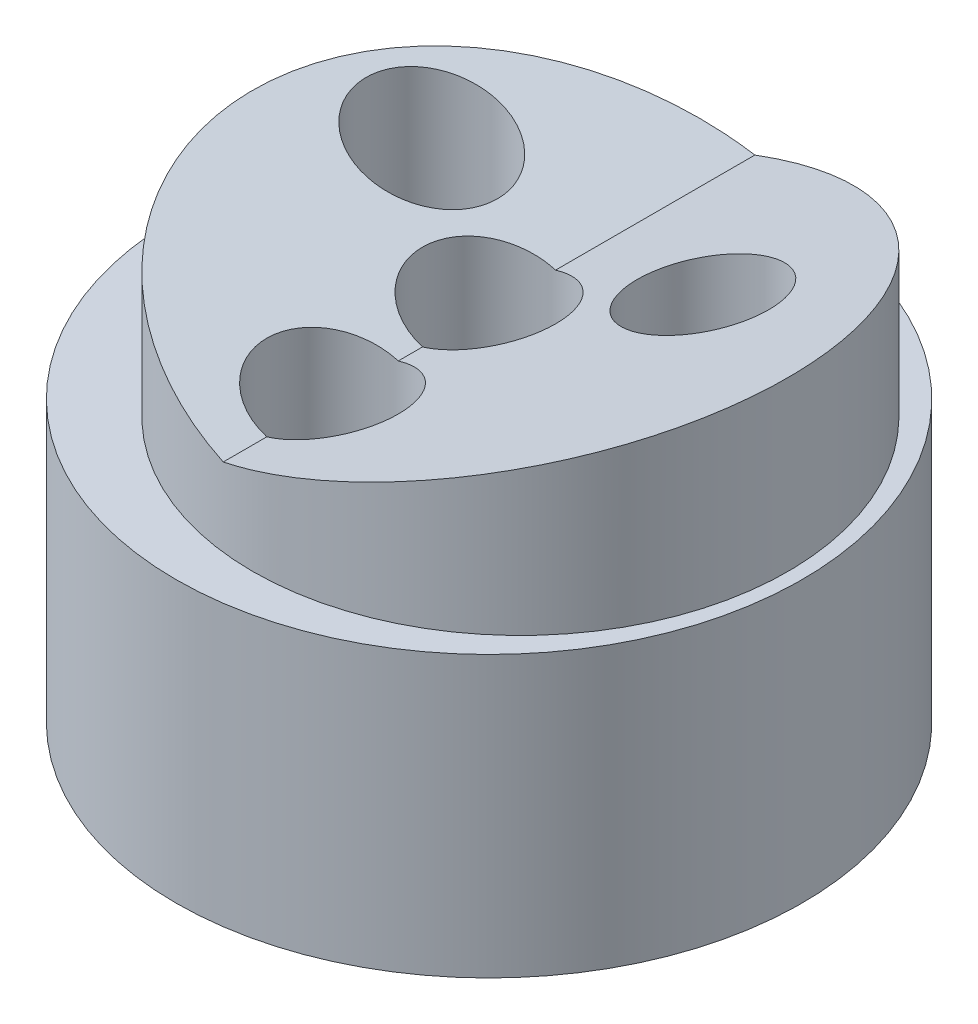
ISO-10303-21;
HEADER;
FILE_DESCRIPTION(('STEP AP214'),'2;1');
FILE_NAME('part.step','',(''),(''),'','','');
FILE_SCHEMA(('AUTOMOTIVE_DESIGN { 1 0 10303 214 1 1 1 1 }'));
ENDSEC;
DATA;
#1=APPLICATION_CONTEXT('core data for automotive mechanical design processes');
#2=APPLICATION_PROTOCOL_DEFINITION('international standard','automotive_design',2000,#1);
#3=PRODUCT_CONTEXT('',#1,'mechanical');
#4=PRODUCT('Part','Part','',(#3));
#5=PRODUCT_RELATED_PRODUCT_CATEGORY('part','',(#4));
#6=PRODUCT_DEFINITION_FORMATION('','',#4);
#7=PRODUCT_DEFINITION_CONTEXT('part definition',#1,'design');
#8=PRODUCT_DEFINITION('design','',#6,#7);
#9=PRODUCT_DEFINITION_SHAPE('','',#8);
#10=(LENGTH_UNIT() NAMED_UNIT(*) SI_UNIT(.MILLI.,.METRE.));
#11=(NAMED_UNIT(*) PLANE_ANGLE_UNIT() SI_UNIT($,.RADIAN.));
#12=(NAMED_UNIT(*) SI_UNIT($,.STERADIAN.) SOLID_ANGLE_UNIT());
#13=UNCERTAINTY_MEASURE_WITH_UNIT(LENGTH_MEASURE(1.E-05),#10,'distance_accuracy_value','');
#14=(GEOMETRIC_REPRESENTATION_CONTEXT(3) GLOBAL_UNCERTAINTY_ASSIGNED_CONTEXT((#13)) GLOBAL_UNIT_ASSIGNED_CONTEXT((#10,
#11,#12)) REPRESENTATION_CONTEXT('',''));
#15=CARTESIAN_POINT('',(0.,0.,0.));
#16=DIRECTION('',(0.,0.,1.));
#17=DIRECTION('',(1.,0.,0.));
#18=AXIS2_PLACEMENT_3D('',#15,#16,#17);
#19=CARTESIAN_POINT('',(-10.,5.49999999999693,-14.01));
#20=DIRECTION('',(-0.287347885566345,-0.957826285221151,0.));
#21=DIRECTION('',(0.957826285221151,-0.287347885566345,0.));
#22=AXIS2_PLACEMENT_3D('',#19,#20,#21);
#23=PLANE('',#22);
#24=CARTESIAN_POINT('',(-4.33012701892218,3.79903810567358,-2.50000000000002));
#25=DIRECTION('',(-0.287347885566345,-0.957826285221151,0.));
#26=DIRECTION('',(0.957826285221151,-0.287347885566345,0.));
#27=AXIS2_PLACEMENT_3D('',#24,#25,#26);
#28=ELLIPSE('',#27,2.19246436687122,2.1);
#29=CARTESIAN_POINT('',(-2.23012701892218,3.16903810567358,-2.50000000000002));
#30=VERTEX_POINT('',#29);
#31=EDGE_CURVE('E93',#30,#30,#28,.T.);
#32=ORIENTED_EDGE('',*,*,#31,.T.);
#33=EDGE_LOOP('',(#32));
#34=FACE_BOUND('',#33,.T.);
#35=DIRECTION('',(0.,0.,1.));
#36=VECTOR('',#35,1.);
#37=CARTESIAN_POINT('',(0.,2.49999999999693,-14.01));
#38=LINE('',#37,#36);
#39=CARTESIAN_POINT('',(0.,2.49999999999693,7.09999999999999));
#40=VERTEX_POINT('',#39);
#41=CARTESIAN_POINT('',(0.,2.49999999999693,8.49131909658328));
#42=VERTEX_POINT('',#41);
#43=EDGE_CURVE('E86',#40,#42,#38,.T.);
#44=ORIENTED_EDGE('',*,*,#43,.F.);
#45=CARTESIAN_POINT('',(0.,2.49999999999693,5.));
#46=DIRECTION('',(-0.287347885566345,-0.957826285221151,0.));
#47=DIRECTION('',(0.957826285221151,-0.287347885566345,0.));
#48=AXIS2_PLACEMENT_3D('',#45,#46,#47);
#49=ELLIPSE('',#48,2.19246436687122,2.1);
#50=CARTESIAN_POINT('',(0.,2.49999999999693,2.89999999999999));
#51=VERTEX_POINT('',#50);
#52=EDGE_CURVE('E76',#40,#51,#49,.T.);
#53=ORIENTED_EDGE('',*,*,#52,.T.);
#54=CARTESIAN_POINT('',(0.,2.49999999999693,2.125));
#55=VERTEX_POINT('',#54);
#56=EDGE_CURVE('E88',#55,#51,#38,.T.);
#57=ORIENTED_EDGE('',*,*,#56,.F.);
#58=CARTESIAN_POINT('',(0.,2.49999999999693,0.));
#59=DIRECTION('',(-0.287347885566345,-0.957826285221151,0.));
#60=DIRECTION('',(0.957826285221151,-0.287347885566345,0.));
#61=AXIS2_PLACEMENT_3D('',#58,#59,#60);
#62=ELLIPSE('',#61,2.21856513314349,2.125);
#63=CARTESIAN_POINT('',(0.,2.49999999999693,-2.125));
#64=VERTEX_POINT('',#63);
#65=EDGE_CURVE('E106',#64,#55,#62,.F.);
#66=ORIENTED_EDGE('',*,*,#65,.F.);
#67=CARTESIAN_POINT('',(0.,2.49999999999693,-8.49131909658329));
#68=VERTEX_POINT('',#67);
#69=EDGE_CURVE('E83',#68,#64,#38,.T.);
#70=ORIENTED_EDGE('',*,*,#69,.F.);
#71=CARTESIAN_POINT('',(1.,2.19999999999693,0.));
#72=DIRECTION('',(-0.287347885566345,-0.957826285221151,0.));
#73=DIRECTION('',(0.957826285221151,-0.287347885566345,0.));
#74=AXIS2_PLACEMENT_3D('',#71,#72,#73);
#75=ELLIPSE('',#74,8.92646206511852,8.55);
#76=EDGE_CURVE('E57',#42,#68,#75,.T.);
#77=ORIENTED_EDGE('',*,*,#76,.F.);
#78=EDGE_LOOP('',(#44,#53,#57,#66,#70,#77));
#79=FACE_BOUND('',#78,.T.);
#80=ADVANCED_FACE('F41',(#34,#79),#23,.F.);
#81=CARTESIAN_POINT('',(10.,5.49999999999693,-14.01));
#82=DIRECTION('',(0.287347885566345,-0.957826285221151,0.));
#83=DIRECTION('',(0.957826285221151,0.287347885566345,0.));
#84=AXIS2_PLACEMENT_3D('',#81,#82,#83);
#85=PLANE('',#84);
#86=CARTESIAN_POINT('',(4.33012701892218,3.79903810567358,-2.50000000000002));
#87=DIRECTION('',(0.287347885566345,-0.957826285221151,0.));
#88=DIRECTION('',(-0.957826285221151,-0.287347885566345,0.));
#89=AXIS2_PLACEMENT_3D('',#86,#87,#88);
#90=ELLIPSE('',#89,2.19246436687122,2.1);
#91=CARTESIAN_POINT('',(2.23012701892218,3.16903810567358,-2.50000000000002));
#92=VERTEX_POINT('',#91);
#93=EDGE_CURVE('E96',#92,#92,#90,.T.);
#94=ORIENTED_EDGE('',*,*,#93,.T.);
#95=EDGE_LOOP('',(#94));
#96=FACE_BOUND('',#95,.T.);
#97=ORIENTED_EDGE('',*,*,#69,.T.);
#98=CARTESIAN_POINT('',(0.,2.49999999999692,0.));
#99=DIRECTION('',(0.287347885566345,-0.957826285221151,0.));
#100=DIRECTION('',(-0.957826285221151,-0.287347885566345,0.));
#101=AXIS2_PLACEMENT_3D('',#98,#99,#100);
#102=ELLIPSE('',#101,2.21856513314349,2.125);
#103=EDGE_CURVE('E104',#55,#64,#102,.F.);
#104=ORIENTED_EDGE('',*,*,#103,.F.);
#105=ORIENTED_EDGE('',*,*,#56,.T.);
#106=CARTESIAN_POINT('',(0.,2.49999999999692,5.));
#107=DIRECTION('',(0.287347885566345,-0.957826285221151,0.));
#108=DIRECTION('',(-0.957826285221151,-0.287347885566345,0.));
#109=AXIS2_PLACEMENT_3D('',#106,#107,#108);
#110=ELLIPSE('',#109,2.19246436687122,2.1);
#111=EDGE_CURVE('E80',#51,#40,#110,.T.);
#112=ORIENTED_EDGE('',*,*,#111,.T.);
#113=ORIENTED_EDGE('',*,*,#43,.T.);
#114=CARTESIAN_POINT('',(1.,2.79999999999693,0.));
#115=DIRECTION('',(0.287347885566345,-0.957826285221151,0.));
#116=DIRECTION('',(-0.957826285221151,-0.287347885566345,0.));
#117=AXIS2_PLACEMENT_3D('',#114,#115,#116);
#118=ELLIPSE('',#117,8.92646206511852,8.55);
#119=EDGE_CURVE('E101',#68,#42,#118,.T.);
#120=ORIENTED_EDGE('',*,*,#119,.F.);
#121=EDGE_LOOP('',(#97,#104,#105,#112,#113,#120));
#122=FACE_BOUND('',#121,.T.);
#123=ADVANCED_FACE('F91',(#96,#122),#85,.F.);
#124=CARTESIAN_POINT('',(-8.55,-8.95,-14.01));
#125=DIRECTION('',(0.,-1.,0.));
#126=DIRECTION('',(0.,0.,-1.));
#127=AXIS2_PLACEMENT_3D('',#124,#125,#126);
#128=PLANE('',#127);
#129=CARTESIAN_POINT('',(0.,-8.95,0.));
#130=DIRECTION('',(0.,-1.,0.));
#131=DIRECTION('',(0.,0.,-1.));
#132=AXIS2_PLACEMENT_3D('',#129,#130,#131);
#133=CIRCLE('',#132,2.125);
#134=CARTESIAN_POINT('',(0.,-8.95,-2.125));
#135=VERTEX_POINT('',#134);
#136=EDGE_CURVE('E45',#135,#135,#133,.F.);
#137=ORIENTED_EDGE('',*,*,#136,.T.);
#138=EDGE_LOOP('',(#137));
#139=FACE_BOUND('',#138,.T.);
#140=CARTESIAN_POINT('',(4.33012701892218,-8.95,-2.50000000000002));
#141=DIRECTION('',(0.,-1.,0.));
#142=DIRECTION('',(0.,0.,-1.));
#143=AXIS2_PLACEMENT_3D('',#140,#141,#142);
#144=CIRCLE('',#143,2.1);
#145=CARTESIAN_POINT('',(4.33012701892218,-8.95,-4.60000000000002));
#146=VERTEX_POINT('',#145);
#147=EDGE_CURVE('E107',#146,#146,#144,.T.);
#148=ORIENTED_EDGE('',*,*,#147,.F.);
#149=EDGE_LOOP('',(#148));
#150=FACE_BOUND('',#149,.T.);
#151=CARTESIAN_POINT('',(-4.33012701892218,-8.95,-2.50000000000002));
#152=DIRECTION('',(0.,-1.,0.));
#153=DIRECTION('',(0.,0.,-1.));
#154=AXIS2_PLACEMENT_3D('',#151,#152,#153);
#155=CIRCLE('',#154,2.1);
#156=CARTESIAN_POINT('',(-4.33012701892218,-8.95,-4.60000000000002));
#157=VERTEX_POINT('',#156);
#158=EDGE_CURVE('E110',#157,#157,#155,.T.);
#159=ORIENTED_EDGE('',*,*,#158,.F.);
#160=EDGE_LOOP('',(#159));
#161=FACE_BOUND('',#160,.T.);
#162=CARTESIAN_POINT('',(0.,-8.95,5.));
#163=DIRECTION('',(0.,-1.,0.));
#164=DIRECTION('',(0.,0.,-1.));
#165=AXIS2_PLACEMENT_3D('',#162,#163,#164);
#166=CIRCLE('',#165,2.1);
#167=CARTESIAN_POINT('',(0.,-8.95,2.9));
#168=VERTEX_POINT('',#167);
#169=EDGE_CURVE('E115',#168,#168,#166,.T.);
#170=ORIENTED_EDGE('',*,*,#169,.F.);
#171=EDGE_LOOP('',(#170));
#172=FACE_BOUND('',#171,.T.);
#173=CARTESIAN_POINT('',(0.,-8.95,0.));
#174=DIRECTION('',(0.,1.,0.));
#175=DIRECTION('',(0.,0.,1.));
#176=AXIS2_PLACEMENT_3D('',#173,#174,#175);
#177=CIRCLE('',#176,10.);
#178=CARTESIAN_POINT('',(0.,-8.95,10.));
#179=VERTEX_POINT('',#178);
#180=EDGE_CURVE('E50',#179,#179,#177,.T.);
#181=ORIENTED_EDGE('',*,*,#180,.F.);
#182=EDGE_LOOP('',(#181));
#183=FACE_BOUND('',#182,.T.);
#184=ADVANCED_FACE('F129',(#139,#150,#161,#172,#183),#128,.T.);
#185=CARTESIAN_POINT('',(0.,31.5,5.));
#186=DIRECTION('',(0.,-1.,0.));
#187=DIRECTION('',(0.,0.,-1.));
#188=AXIS2_PLACEMENT_3D('',#185,#186,#187);
#189=CYLINDRICAL_SURFACE('',#188,2.1);
#190=ORIENTED_EDGE('',*,*,#111,.F.);
#191=ORIENTED_EDGE('',*,*,#52,.F.);
#192=EDGE_LOOP('',(#190,#191));
#193=FACE_BOUND('',#192,.T.);
#194=ORIENTED_EDGE('',*,*,#169,.T.);
#195=EDGE_LOOP('',(#194));
#196=FACE_BOUND('',#195,.T.);
#197=ADVANCED_FACE('F77',(#193,#196),#189,.F.);
#198=CARTESIAN_POINT('',(-4.33012701892218,31.5,-2.50000000000002));
#199=DIRECTION('',(0.,-1.,0.));
#200=DIRECTION('',(0.,0.,-1.));
#201=AXIS2_PLACEMENT_3D('',#198,#199,#200);
#202=CYLINDRICAL_SURFACE('',#201,2.1);
#203=ORIENTED_EDGE('',*,*,#31,.F.);
#204=EDGE_LOOP('',(#203));
#205=FACE_BOUND('',#204,.T.);
#206=ORIENTED_EDGE('',*,*,#158,.T.);
#207=EDGE_LOOP('',(#206));
#208=FACE_BOUND('',#207,.T.);
#209=ADVANCED_FACE('F138',(#205,#208),#202,.F.);
#210=CARTESIAN_POINT('',(4.33012701892218,31.5,-2.50000000000002));
#211=DIRECTION('',(0.,-1.,0.));
#212=DIRECTION('',(0.,0.,-1.));
#213=AXIS2_PLACEMENT_3D('',#210,#211,#212);
#214=CYLINDRICAL_SURFACE('',#213,2.1);
#215=ORIENTED_EDGE('',*,*,#93,.F.);
#216=EDGE_LOOP('',(#215));
#217=FACE_BOUND('',#216,.T.);
#218=ORIENTED_EDGE('',*,*,#147,.T.);
#219=EDGE_LOOP('',(#218));
#220=FACE_BOUND('',#219,.T.);
#221=ADVANCED_FACE('F160',(#217,#220),#214,.F.);
#222=CARTESIAN_POINT('',(0.,30.75,0.));
#223=DIRECTION('',(0.,-1.,0.));
#224=DIRECTION('',(0.,0.,-1.));
#225=AXIS2_PLACEMENT_3D('',#222,#223,#224);
#226=CYLINDRICAL_SURFACE('',#225,2.125);
#227=ORIENTED_EDGE('',*,*,#65,.T.);
#228=ORIENTED_EDGE('',*,*,#103,.T.);
#229=EDGE_LOOP('',(#227,#228));
#230=FACE_BOUND('',#229,.T.);
#231=ORIENTED_EDGE('',*,*,#136,.F.);
#232=EDGE_LOOP('',(#231));
#233=FACE_BOUND('',#232,.T.);
#234=ADVANCED_FACE('F43',(#230,#233),#226,.F.);
#235=CARTESIAN_POINT('',(0.,0.,0.));
#236=DIRECTION('',(0.,-1.,0.));
#237=DIRECTION('',(0.,0.,-1.));
#238=AXIS2_PLACEMENT_3D('',#235,#236,#237);
#239=PLANE('',#238);
#240=CARTESIAN_POINT('',(1.,0.,0.));
#241=DIRECTION('',(0.,1.,0.));
#242=DIRECTION('',(0.,0.,1.));
#243=AXIS2_PLACEMENT_3D('',#240,#241,#242);
#244=CIRCLE('',#243,8.55);
#245=CARTESIAN_POINT('',(1.,0.,8.55));
#246=VERTEX_POINT('',#245);
#247=EDGE_CURVE('E120',#246,#246,#244,.T.);
#248=ORIENTED_EDGE('',*,*,#247,.F.);
#249=EDGE_LOOP('',(#248));
#250=FACE_BOUND('',#249,.T.);
#251=CARTESIAN_POINT('',(0.,0.,0.));
#252=DIRECTION('',(0.,1.,0.));
#253=DIRECTION('',(0.,0.,1.));
#254=AXIS2_PLACEMENT_3D('',#251,#252,#253);
#255=CIRCLE('',#254,10.);
#256=CARTESIAN_POINT('',(0.,0.,10.));
#257=VERTEX_POINT('',#256);
#258=EDGE_CURVE('E11',#257,#257,#255,.T.);
#259=ORIENTED_EDGE('',*,*,#258,.T.);
#260=EDGE_LOOP('',(#259));
#261=FACE_BOUND('',#260,.T.);
#262=ADVANCED_FACE('F154',(#250,#261),#239,.F.);
#263=CARTESIAN_POINT('',(0.,-8.95,0.));
#264=DIRECTION('',(0.,1.,0.));
#265=DIRECTION('',(0.,0.,1.));
#266=AXIS2_PLACEMENT_3D('',#263,#264,#265);
#267=CYLINDRICAL_SURFACE('',#266,10.);
#268=CARTESIAN_POINT('',(0.,-8.95,10.));
#269=CARTESIAN_POINT('',(0.,-8.85677083333333,10.));
#270=CARTESIAN_POINT('',(0.,-8.76354166666667,10.));
#271=CARTESIAN_POINT('',(0.,-8.57708333333333,10.));
#272=CARTESIAN_POINT('',(0.,-8.48385416666667,10.));
#273=CARTESIAN_POINT('',(0.,-8.29739583333333,10.));
#274=CARTESIAN_POINT('',(0.,-8.20416666666667,10.));
#275=CARTESIAN_POINT('',(0.,-8.01770833333333,10.));
#276=CARTESIAN_POINT('',(0.,-7.92447916666667,10.));
#277=CARTESIAN_POINT('',(0.,-7.73802083333333,10.));
#278=CARTESIAN_POINT('',(0.,-7.64479166666667,10.));
#279=CARTESIAN_POINT('',(0.,-7.45833333333333,10.));
#280=CARTESIAN_POINT('',(0.,-7.36510416666667,10.));
#281=CARTESIAN_POINT('',(0.,-7.17864583333333,10.));
#282=CARTESIAN_POINT('',(0.,-7.08541666666667,10.));
#283=CARTESIAN_POINT('',(0.,-6.89895833333333,10.));
#284=CARTESIAN_POINT('',(0.,-6.80572916666667,10.));
#285=CARTESIAN_POINT('',(0.,-6.61927083333333,10.));
#286=CARTESIAN_POINT('',(0.,-6.52604166666667,10.));
#287=CARTESIAN_POINT('',(0.,-6.33958333333333,10.));
#288=CARTESIAN_POINT('',(0.,-6.24635416666667,10.));
#289=CARTESIAN_POINT('',(0.,-6.05989583333333,10.));
#290=CARTESIAN_POINT('',(0.,-5.96666666666667,10.));
#291=CARTESIAN_POINT('',(0.,-5.78020833333333,10.));
#292=CARTESIAN_POINT('',(0.,-5.68697916666667,10.));
#293=CARTESIAN_POINT('',(0.,-5.50052083333333,10.));
#294=CARTESIAN_POINT('',(0.,-5.40729166666667,10.));
#295=CARTESIAN_POINT('',(0.,-5.22083333333333,10.));
#296=CARTESIAN_POINT('',(0.,-5.12760416666667,10.));
#297=CARTESIAN_POINT('',(0.,-4.94114583333333,10.));
#298=CARTESIAN_POINT('',(0.,-4.84791666666667,10.));
#299=CARTESIAN_POINT('',(0.,-4.66145833333333,10.));
#300=CARTESIAN_POINT('',(0.,-4.56822916666667,10.));
#301=CARTESIAN_POINT('',(0.,-4.38177083333334,10.));
#302=CARTESIAN_POINT('',(0.,-4.28854166666667,10.));
#303=CARTESIAN_POINT('',(0.,-4.10208333333333,10.));
#304=CARTESIAN_POINT('',(0.,-4.00885416666667,10.));
#305=CARTESIAN_POINT('',(0.,-3.82239583333333,10.));
#306=CARTESIAN_POINT('',(0.,-3.72916666666667,10.));
#307=CARTESIAN_POINT('',(0.,-3.54270833333334,10.));
#308=CARTESIAN_POINT('',(0.,-3.44947916666667,10.));
#309=CARTESIAN_POINT('',(0.,-3.26302083333333,10.));
#310=CARTESIAN_POINT('',(0.,-3.16979166666667,10.));
#311=CARTESIAN_POINT('',(0.,-2.98333333333333,10.));
#312=CARTESIAN_POINT('',(0.,-2.89010416666667,10.));
#313=CARTESIAN_POINT('',(0.,-2.70364583333334,10.));
#314=CARTESIAN_POINT('',(0.,-2.61041666666667,10.));
#315=CARTESIAN_POINT('',(0.,-2.42395833333334,10.));
#316=CARTESIAN_POINT('',(0.,-2.33072916666667,10.));
#317=CARTESIAN_POINT('',(0.,-2.14427083333333,10.));
#318=CARTESIAN_POINT('',(0.,-2.05104166666667,10.));
#319=CARTESIAN_POINT('',(0.,-1.86458333333333,10.));
#320=CARTESIAN_POINT('',(0.,-1.77135416666667,10.));
#321=CARTESIAN_POINT('',(0.,-1.58489583333334,10.));
#322=CARTESIAN_POINT('',(0.,-1.49166666666667,10.));
#323=CARTESIAN_POINT('',(0.,-1.30520833333334,10.));
#324=CARTESIAN_POINT('',(0.,-1.21197916666667,10.));
#325=CARTESIAN_POINT('',(0.,-1.02552083333333,10.));
#326=CARTESIAN_POINT('',(0.,-0.932291666666668,10.));
#327=CARTESIAN_POINT('',(0.,-0.745833333333335,10.));
#328=CARTESIAN_POINT('',(0.,-0.652604166666669,10.));
#329=CARTESIAN_POINT('',(0.,-0.466145833333336,10.));
#330=CARTESIAN_POINT('',(0.,-0.372916666666669,10.));
#331=CARTESIAN_POINT('',(0.,-0.186458333333335,10.));
#332=CARTESIAN_POINT('',(0.,-0.0932291666666685,10.));
#333=CARTESIAN_POINT('',(0.,0.,10.));
#334=B_SPLINE_CURVE_WITH_KNOTS('',3,(#268,#269,#270,#271,#272,#273,#274,#275,#276,#277,#278,
#279,#280,#281,#282,#283,#284,#285,#286,#287,#288,#289,#290,#291,#292,#293,#294,#295,#296,#297,
#298,#299,#300,#301,#302,#303,#304,#305,#306,#307,#308,#309,#310,#311,#312,#313,#314,#315,#316,
#317,#318,#319,#320,#321,#322,#323,#324,#325,#326,#327,#328,#329,#330,#331,#332,#333),
.UNSPECIFIED.,.F.,.F.,(4,2,2,2,2,2,2,2,2,2,2,2,2,2,2,2,2,2,2,2,2,2,2,2,2,2,2,2,2,2,2,2,4),(0.,
0.279687499999999,0.559374999999999,0.839062499999999,1.11875,1.3984375,1.678125,1.9578125,
2.2375,2.5171875,2.796875,3.0765625,3.35625,3.6359375,3.915625,4.1953125,4.475,4.7546875,
5.034375,5.3140625,5.59375,5.8734375,6.153125,6.4328125,6.7125,6.9921875,7.271875,7.5515625,
7.83125,8.1109375,8.390625,8.6703125,8.95),.UNSPECIFIED.);
#335=EDGE_CURVE('BSEAM126',#179,#257,#334,.T.);
#336=ORIENTED_EDGE('',*,*,#180,.T.);
#337=ORIENTED_EDGE('',*,*,#258,.F.);
#338=ORIENTED_EDGE('',*,*,#335,.T.);
#339=ORIENTED_EDGE('',*,*,#335,.F.);
#340=EDGE_LOOP('',(#336,#338,#337,#339));
#341=FACE_BOUND('',#340,.T.);
#342=ADVANCED_FACE('F126',(#341),#267,.T.);
#343=CARTESIAN_POINT('',(1.,7.,0.));
#344=DIRECTION('',(0.,-1.,0.));
#345=DIRECTION('',(0.,0.,-1.));
#346=AXIS2_PLACEMENT_3D('',#343,#344,#345);
#347=CYLINDRICAL_SURFACE('',#346,8.55);
#348=ORIENTED_EDGE('',*,*,#76,.T.);
#349=ORIENTED_EDGE('',*,*,#119,.T.);
#350=EDGE_LOOP('',(#348,#349));
#351=FACE_BOUND('',#350,.T.);
#352=ORIENTED_EDGE('',*,*,#247,.T.);
#353=EDGE_LOOP('',(#352));
#354=FACE_BOUND('',#353,.T.);
#355=ADVANCED_FACE('F133',(#351,#354),#347,.T.);
#356=CLOSED_SHELL('',(#80,#123,#184,#197,#209,#221,#234,#262,#342,#355));
#357=MANIFOLD_SOLID_BREP('B2',#356);
#358=ADVANCED_BREP_SHAPE_REPRESENTATION('',(#18,#357),#14);
#359=SHAPE_DEFINITION_REPRESENTATION(#9,#358);
ENDSEC;
END-ISO-10303-21;
